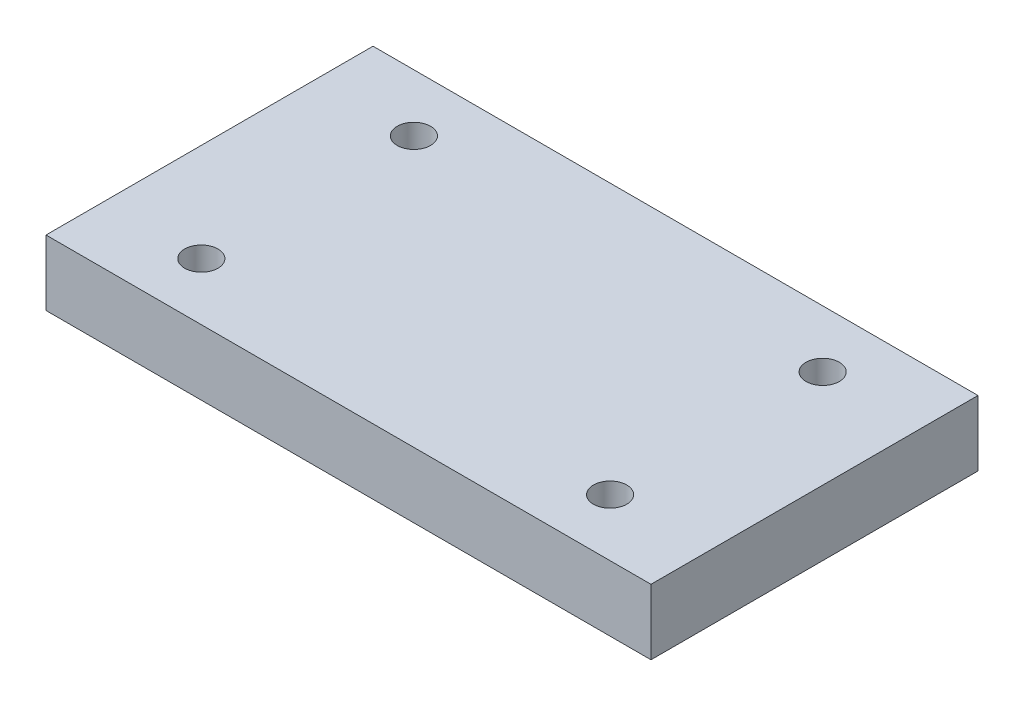
ISO-10303-21;
HEADER;
FILE_DESCRIPTION(('STEP AP214'),'2;1');
FILE_NAME('part.step','',(''),(''),'','','');
FILE_SCHEMA(('AUTOMOTIVE_DESIGN { 1 0 10303 214 1 1 1 1 }'));
ENDSEC;
DATA;
#1=APPLICATION_CONTEXT('core data for automotive mechanical design processes');
#2=APPLICATION_PROTOCOL_DEFINITION('international standard','automotive_design',2000,#1);
#3=PRODUCT_CONTEXT('',#1,'mechanical');
#4=PRODUCT('Part','Part','',(#3));
#5=PRODUCT_RELATED_PRODUCT_CATEGORY('part','',(#4));
#6=PRODUCT_DEFINITION_FORMATION('','',#4);
#7=PRODUCT_DEFINITION_CONTEXT('part definition',#1,'design');
#8=PRODUCT_DEFINITION('design','',#6,#7);
#9=PRODUCT_DEFINITION_SHAPE('','',#8);
#10=(LENGTH_UNIT() NAMED_UNIT(*) SI_UNIT(.MILLI.,.METRE.));
#11=(NAMED_UNIT(*) PLANE_ANGLE_UNIT() SI_UNIT($,.RADIAN.));
#12=(NAMED_UNIT(*) SI_UNIT($,.STERADIAN.) SOLID_ANGLE_UNIT());
#13=UNCERTAINTY_MEASURE_WITH_UNIT(LENGTH_MEASURE(1.E-05),#10,'distance_accuracy_value','');
#14=(GEOMETRIC_REPRESENTATION_CONTEXT(3) GLOBAL_UNCERTAINTY_ASSIGNED_CONTEXT((#13)) GLOBAL_UNIT_ASSIGNED_CONTEXT((#10,
#11,#12)) REPRESENTATION_CONTEXT('',''));
#15=CARTESIAN_POINT('',(0.,0.,0.));
#16=DIRECTION('',(0.,0.,1.));
#17=DIRECTION('',(1.,0.,0.));
#18=AXIS2_PLACEMENT_3D('',#15,#16,#17);
#19=CARTESIAN_POINT('',(0.,20.,0.));
#20=DIRECTION('',(0.,-1.,0.));
#21=DIRECTION('',(0.,0.,-1.));
#22=AXIS2_PLACEMENT_3D('',#19,#20,#21);
#23=PLANE('',#22);
#24=CARTESIAN_POINT('',(62.5,20.,-32.5));
#25=DIRECTION('',(0.,1.,0.));
#26=DIRECTION('',(0.,0.,1.));
#27=AXIS2_PLACEMENT_3D('',#24,#25,#26);
#28=CIRCLE('',#27,5.09999999999999);
#29=CARTESIAN_POINT('',(62.5,20.,-27.4));
#30=VERTEX_POINT('',#29);
#31=EDGE_CURVE('E152',#30,#30,#28,.T.);
#32=ORIENTED_EDGE('',*,*,#31,.F.);
#33=EDGE_LOOP('',(#32));
#34=FACE_BOUND('',#33,.T.);
#35=CARTESIAN_POINT('',(62.5,20.,32.5));
#36=DIRECTION('',(0.,1.,0.));
#37=DIRECTION('',(0.,0.,1.));
#38=AXIS2_PLACEMENT_3D('',#35,#36,#37);
#39=CIRCLE('',#38,5.09999999999999);
#40=CARTESIAN_POINT('',(62.5,20.,37.6));
#41=VERTEX_POINT('',#40);
#42=EDGE_CURVE('E144',#41,#41,#39,.T.);
#43=ORIENTED_EDGE('',*,*,#42,.F.);
#44=EDGE_LOOP('',(#43));
#45=FACE_BOUND('',#44,.T.);
#46=DIRECTION('',(0.,0.,-1.));
#47=VECTOR('',#46,1.);
#48=CARTESIAN_POINT('',(92.5,20.,50.));
#49=LINE('',#48,#47);
#50=CARTESIAN_POINT('',(92.5,20.,50.));
#51=VERTEX_POINT('',#50);
#52=CARTESIAN_POINT('',(92.5,20.,-50.));
#53=VERTEX_POINT('',#52);
#54=EDGE_CURVE('E96',#51,#53,#49,.T.);
#55=ORIENTED_EDGE('',*,*,#54,.T.);
#56=DIRECTION('',(-1.,0.,0.));
#57=VECTOR('',#56,1.);
#58=CARTESIAN_POINT('',(-92.5,20.,-50.));
#59=LINE('',#58,#57);
#60=CARTESIAN_POINT('',(-92.5,20.,-50.));
#61=VERTEX_POINT('',#60);
#62=EDGE_CURVE('E91',#53,#61,#59,.T.);
#63=ORIENTED_EDGE('',*,*,#62,.T.);
#64=DIRECTION('',(0.,0.,1.));
#65=VECTOR('',#64,1.);
#66=CARTESIAN_POINT('',(-92.5,20.,50.));
#67=LINE('',#66,#65);
#68=CARTESIAN_POINT('',(-92.5,20.,50.));
#69=VERTEX_POINT('',#68);
#70=EDGE_CURVE('E94',#61,#69,#67,.T.);
#71=ORIENTED_EDGE('',*,*,#70,.T.);
#72=DIRECTION('',(1.,0.,0.));
#73=VECTOR('',#72,1.);
#74=CARTESIAN_POINT('',(-92.5,20.,50.));
#75=LINE('',#74,#73);
#76=EDGE_CURVE('E61',#69,#51,#75,.T.);
#77=ORIENTED_EDGE('',*,*,#76,.T.);
#78=EDGE_LOOP('',(#55,#63,#71,#77));
#79=FACE_BOUND('',#78,.T.);
#80=CARTESIAN_POINT('',(-62.5,20.,32.5));
#81=DIRECTION('',(0.,1.,0.));
#82=DIRECTION('',(0.,0.,1.));
#83=AXIS2_PLACEMENT_3D('',#80,#81,#82);
#84=CIRCLE('',#83,5.1);
#85=CARTESIAN_POINT('',(-62.5,20.,37.6));
#86=VERTEX_POINT('',#85);
#87=EDGE_CURVE('E136',#86,#86,#84,.T.);
#88=ORIENTED_EDGE('',*,*,#87,.F.);
#89=EDGE_LOOP('',(#88));
#90=FACE_BOUND('',#89,.T.);
#91=CARTESIAN_POINT('',(-62.5,20.,-32.5));
#92=DIRECTION('',(0.,1.,0.));
#93=DIRECTION('',(0.,0.,1.));
#94=AXIS2_PLACEMENT_3D('',#91,#92,#93);
#95=CIRCLE('',#94,5.1);
#96=CARTESIAN_POINT('',(-62.5,20.,-27.4));
#97=VERTEX_POINT('',#96);
#98=EDGE_CURVE('E160',#97,#97,#95,.T.);
#99=ORIENTED_EDGE('',*,*,#98,.F.);
#100=EDGE_LOOP('',(#99));
#101=FACE_BOUND('',#100,.T.);
#102=ADVANCED_FACE('F43',(#34,#45,#79,#90,#101),#23,.F.);
#103=CARTESIAN_POINT('',(92.5,20.,50.));
#104=DIRECTION('',(-1.,0.,0.));
#105=DIRECTION('',(0.,0.,1.));
#106=AXIS2_PLACEMENT_3D('',#103,#104,#105);
#107=PLANE('',#106);
#108=DIRECTION('',(0.,0.,-1.));
#109=VECTOR('',#108,1.);
#110=CARTESIAN_POINT('',(92.5,0.,50.));
#111=LINE('',#110,#109);
#112=CARTESIAN_POINT('',(92.5,0.,50.));
#113=VERTEX_POINT('',#112);
#114=CARTESIAN_POINT('',(92.5,0.,-50.));
#115=VERTEX_POINT('',#114);
#116=EDGE_CURVE('E112',#113,#115,#111,.T.);
#117=ORIENTED_EDGE('',*,*,#116,.T.);
#118=DIRECTION('',(0.,-1.,0.));
#119=VECTOR('',#118,1.);
#120=CARTESIAN_POINT('',(92.5,20.,-50.));
#121=LINE('',#120,#119);
#122=EDGE_CURVE('E11',#53,#115,#121,.T.);
#123=ORIENTED_EDGE('',*,*,#122,.F.);
#124=ORIENTED_EDGE('',*,*,#54,.F.);
#125=DIRECTION('',(0.,-1.,0.));
#126=VECTOR('',#125,1.);
#127=CARTESIAN_POINT('',(92.5,20.,50.));
#128=LINE('',#127,#126);
#129=EDGE_CURVE('E108',#51,#113,#128,.T.);
#130=ORIENTED_EDGE('',*,*,#129,.T.);
#131=EDGE_LOOP('',(#117,#123,#124,#130));
#132=FACE_BOUND('',#131,.T.);
#133=ADVANCED_FACE('F45',(#132),#107,.F.);
#134=CARTESIAN_POINT('',(-92.5,20.,-50.));
#135=DIRECTION('',(0.,0.,1.));
#136=DIRECTION('',(1.,0.,0.));
#137=AXIS2_PLACEMENT_3D('',#134,#135,#136);
#138=PLANE('',#137);
#139=DIRECTION('',(-1.,0.,0.));
#140=VECTOR('',#139,1.);
#141=CARTESIAN_POINT('',(-92.5,0.,-50.));
#142=LINE('',#141,#140);
#143=CARTESIAN_POINT('',(-92.5,0.,-50.));
#144=VERTEX_POINT('',#143);
#145=EDGE_CURVE('E101',#115,#144,#142,.T.);
#146=ORIENTED_EDGE('',*,*,#145,.T.);
#147=DIRECTION('',(0.,-1.,0.));
#148=VECTOR('',#147,1.);
#149=CARTESIAN_POINT('',(-92.5,20.,-50.));
#150=LINE('',#149,#148);
#151=EDGE_CURVE('E53',#61,#144,#150,.T.);
#152=ORIENTED_EDGE('',*,*,#151,.F.);
#153=ORIENTED_EDGE('',*,*,#62,.F.);
#154=ORIENTED_EDGE('',*,*,#122,.T.);
#155=EDGE_LOOP('',(#146,#152,#153,#154));
#156=FACE_BOUND('',#155,.T.);
#157=ADVANCED_FACE('F100',(#156),#138,.F.);
#158=CARTESIAN_POINT('',(-92.5,20.,50.));
#159=DIRECTION('',(1.,0.,0.));
#160=DIRECTION('',(0.,0.,-1.));
#161=AXIS2_PLACEMENT_3D('',#158,#159,#160);
#162=PLANE('',#161);
#163=DIRECTION('',(0.,0.,1.));
#164=VECTOR('',#163,1.);
#165=CARTESIAN_POINT('',(-92.5,0.,50.));
#166=LINE('',#165,#164);
#167=CARTESIAN_POINT('',(-92.5,0.,50.));
#168=VERTEX_POINT('',#167);
#169=EDGE_CURVE('E78',#144,#168,#166,.T.);
#170=ORIENTED_EDGE('',*,*,#169,.T.);
#171=DIRECTION('',(0.,-1.,0.));
#172=VECTOR('',#171,1.);
#173=CARTESIAN_POINT('',(-92.5,20.,50.));
#174=LINE('',#173,#172);
#175=EDGE_CURVE('E103',#69,#168,#174,.T.);
#176=ORIENTED_EDGE('',*,*,#175,.F.);
#177=ORIENTED_EDGE('',*,*,#70,.F.);
#178=ORIENTED_EDGE('',*,*,#151,.T.);
#179=EDGE_LOOP('',(#170,#176,#177,#178));
#180=FACE_BOUND('',#179,.T.);
#181=ADVANCED_FACE('F104',(#180),#162,.F.);
#182=CARTESIAN_POINT('',(-92.5,20.,50.));
#183=DIRECTION('',(0.,0.,-1.));
#184=DIRECTION('',(-1.,0.,0.));
#185=AXIS2_PLACEMENT_3D('',#182,#183,#184);
#186=PLANE('',#185);
#187=DIRECTION('',(1.,0.,0.));
#188=VECTOR('',#187,1.);
#189=CARTESIAN_POINT('',(-92.5,0.,50.));
#190=LINE('',#189,#188);
#191=EDGE_CURVE('E84',#168,#113,#190,.T.);
#192=ORIENTED_EDGE('',*,*,#191,.T.);
#193=ORIENTED_EDGE('',*,*,#129,.F.);
#194=ORIENTED_EDGE('',*,*,#76,.F.);
#195=ORIENTED_EDGE('',*,*,#175,.T.);
#196=EDGE_LOOP('',(#192,#193,#194,#195));
#197=FACE_BOUND('',#196,.T.);
#198=ADVANCED_FACE('F126',(#197),#186,.F.);
#199=CARTESIAN_POINT('',(0.,0.,0.));
#200=DIRECTION('',(0.,-1.,0.));
#201=DIRECTION('',(0.,0.,-1.));
#202=AXIS2_PLACEMENT_3D('',#199,#200,#201);
#203=PLANE('',#202);
#204=CARTESIAN_POINT('',(-62.5,0.,-32.5));
#205=DIRECTION('',(0.,-1.,0.));
#206=DIRECTION('',(0.,0.,-1.));
#207=AXIS2_PLACEMENT_3D('',#204,#205,#206);
#208=CIRCLE('',#207,5.1);
#209=CARTESIAN_POINT('',(-62.5,0.,-37.6));
#210=VERTEX_POINT('',#209);
#211=EDGE_CURVE('E156',#210,#210,#208,.T.);
#212=ORIENTED_EDGE('',*,*,#211,.F.);
#213=EDGE_LOOP('',(#212));
#214=FACE_BOUND('',#213,.T.);
#215=CARTESIAN_POINT('',(62.5,0.,-32.5));
#216=DIRECTION('',(0.,-1.,0.));
#217=DIRECTION('',(0.,0.,-1.));
#218=AXIS2_PLACEMENT_3D('',#215,#216,#217);
#219=CIRCLE('',#218,5.09999999999999);
#220=CARTESIAN_POINT('',(62.5,0.,-37.6));
#221=VERTEX_POINT('',#220);
#222=EDGE_CURVE('E148',#221,#221,#219,.T.);
#223=ORIENTED_EDGE('',*,*,#222,.F.);
#224=EDGE_LOOP('',(#223));
#225=FACE_BOUND('',#224,.T.);
#226=CARTESIAN_POINT('',(62.5,0.,32.5));
#227=DIRECTION('',(0.,-1.,0.));
#228=DIRECTION('',(0.,0.,-1.));
#229=AXIS2_PLACEMENT_3D('',#226,#227,#228);
#230=CIRCLE('',#229,5.09999999999999);
#231=CARTESIAN_POINT('',(62.5,0.,27.4));
#232=VERTEX_POINT('',#231);
#233=EDGE_CURVE('E140',#232,#232,#230,.T.);
#234=ORIENTED_EDGE('',*,*,#233,.F.);
#235=EDGE_LOOP('',(#234));
#236=FACE_BOUND('',#235,.T.);
#237=CARTESIAN_POINT('',(-62.5,0.,32.5));
#238=DIRECTION('',(0.,-1.,0.));
#239=DIRECTION('',(0.,0.,-1.));
#240=AXIS2_PLACEMENT_3D('',#237,#238,#239);
#241=CIRCLE('',#240,5.1);
#242=CARTESIAN_POINT('',(-62.5,0.,27.4));
#243=VERTEX_POINT('',#242);
#244=EDGE_CURVE('E116',#243,#243,#241,.T.);
#245=ORIENTED_EDGE('',*,*,#244,.F.);
#246=EDGE_LOOP('',(#245));
#247=FACE_BOUND('',#246,.T.);
#248=ORIENTED_EDGE('',*,*,#116,.F.);
#249=ORIENTED_EDGE('',*,*,#191,.F.);
#250=ORIENTED_EDGE('',*,*,#169,.F.);
#251=ORIENTED_EDGE('',*,*,#145,.F.);
#252=EDGE_LOOP('',(#248,#249,#250,#251));
#253=FACE_BOUND('',#252,.T.);
#254=ADVANCED_FACE('F129',(#214,#225,#236,#247,#253),#203,.T.);
#255=CARTESIAN_POINT('',(-62.5,20.,32.5));
#256=DIRECTION('',(0.,1.,0.));
#257=DIRECTION('',(0.,0.,1.));
#258=AXIS2_PLACEMENT_3D('',#255,#256,#257);
#259=CYLINDRICAL_SURFACE('',#258,5.1);
#260=ORIENTED_EDGE('',*,*,#87,.T.);
#261=EDGE_LOOP('',(#260));
#262=FACE_BOUND('',#261,.T.);
#263=ORIENTED_EDGE('',*,*,#244,.T.);
#264=EDGE_LOOP('',(#263));
#265=FACE_BOUND('',#264,.T.);
#266=ADVANCED_FACE('F178',(#262,#265),#259,.F.);
#267=CARTESIAN_POINT('',(62.5,20.,32.5));
#268=DIRECTION('',(0.,1.,0.));
#269=DIRECTION('',(0.,0.,1.));
#270=AXIS2_PLACEMENT_3D('',#267,#268,#269);
#271=CYLINDRICAL_SURFACE('',#270,5.09999999999999);
#272=ORIENTED_EDGE('',*,*,#42,.T.);
#273=EDGE_LOOP('',(#272));
#274=FACE_BOUND('',#273,.T.);
#275=ORIENTED_EDGE('',*,*,#233,.T.);
#276=EDGE_LOOP('',(#275));
#277=FACE_BOUND('',#276,.T.);
#278=ADVANCED_FACE('F211',(#274,#277),#271,.F.);
#279=CARTESIAN_POINT('',(62.5,20.,-32.5));
#280=DIRECTION('',(0.,1.,0.));
#281=DIRECTION('',(0.,0.,1.));
#282=AXIS2_PLACEMENT_3D('',#279,#280,#281);
#283=CYLINDRICAL_SURFACE('',#282,5.09999999999999);
#284=ORIENTED_EDGE('',*,*,#31,.T.);
#285=EDGE_LOOP('',(#284));
#286=FACE_BOUND('',#285,.T.);
#287=ORIENTED_EDGE('',*,*,#222,.T.);
#288=EDGE_LOOP('',(#287));
#289=FACE_BOUND('',#288,.T.);
#290=ADVANCED_FACE('F219',(#286,#289),#283,.F.);
#291=CARTESIAN_POINT('',(-62.5,20.,-32.5));
#292=DIRECTION('',(0.,1.,0.));
#293=DIRECTION('',(0.,0.,1.));
#294=AXIS2_PLACEMENT_3D('',#291,#292,#293);
#295=CYLINDRICAL_SURFACE('',#294,5.1);
#296=ORIENTED_EDGE('',*,*,#98,.T.);
#297=EDGE_LOOP('',(#296));
#298=FACE_BOUND('',#297,.T.);
#299=ORIENTED_EDGE('',*,*,#211,.T.);
#300=EDGE_LOOP('',(#299));
#301=FACE_BOUND('',#300,.T.);
#302=ADVANCED_FACE('F165',(#298,#301),#295,.F.);
#303=CLOSED_SHELL('',(#102,#133,#157,#181,#198,#254,#266,#278,#290,#302));
#304=MANIFOLD_SOLID_BREP('B2',#303);
#305=ADVANCED_BREP_SHAPE_REPRESENTATION('',(#18,#304),#14);
#306=SHAPE_DEFINITION_REPRESENTATION(#9,#305);
ENDSEC;
END-ISO-10303-21;
